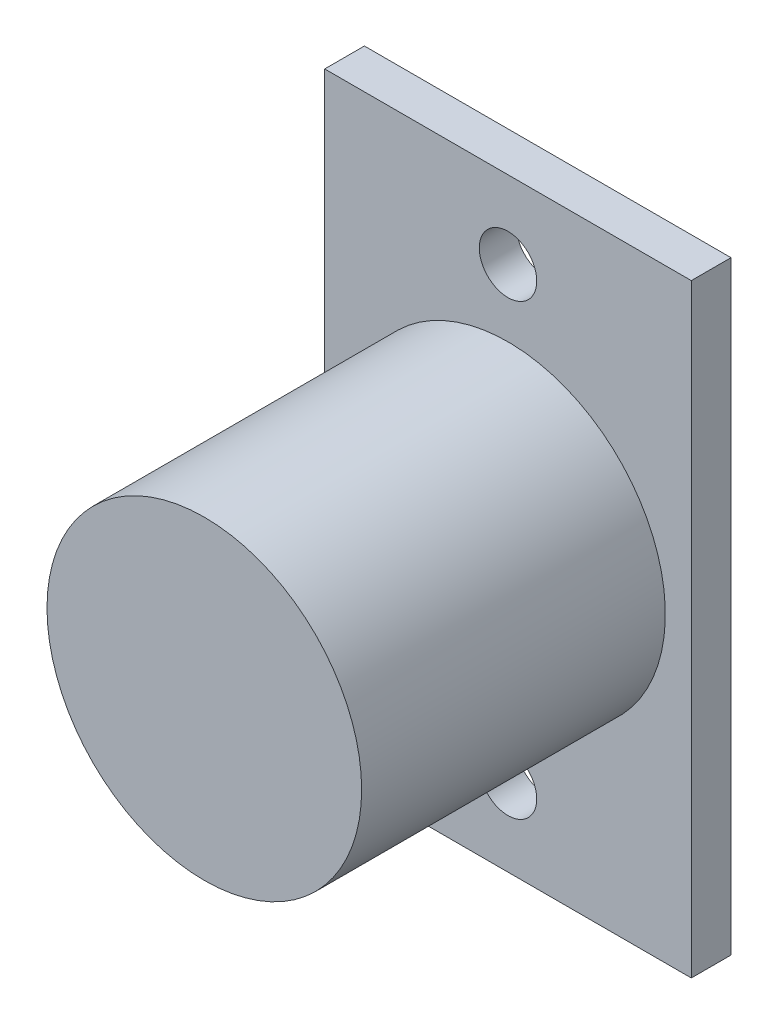
ISO-10303-21;
HEADER;
FILE_DESCRIPTION(('STEP AP214'),'2;1');
FILE_NAME('part.step','',(''),(''),'','','');
FILE_SCHEMA(('AUTOMOTIVE_DESIGN { 1 0 10303 214 1 1 1 1 }'));
ENDSEC;
DATA;
#1=APPLICATION_CONTEXT('core data for automotive mechanical design processes');
#2=APPLICATION_PROTOCOL_DEFINITION('international standard','automotive_design',2000,#1);
#3=PRODUCT_CONTEXT('',#1,'mechanical');
#4=PRODUCT('Part','Part','',(#3));
#5=PRODUCT_RELATED_PRODUCT_CATEGORY('part','',(#4));
#6=PRODUCT_DEFINITION_FORMATION('','',#4);
#7=PRODUCT_DEFINITION_CONTEXT('part definition',#1,'design');
#8=PRODUCT_DEFINITION('design','',#6,#7);
#9=PRODUCT_DEFINITION_SHAPE('','',#8);
#10=(LENGTH_UNIT() NAMED_UNIT(*) SI_UNIT(.MILLI.,.METRE.));
#11=(NAMED_UNIT(*) PLANE_ANGLE_UNIT() SI_UNIT($,.RADIAN.));
#12=(NAMED_UNIT(*) SI_UNIT($,.STERADIAN.) SOLID_ANGLE_UNIT());
#13=UNCERTAINTY_MEASURE_WITH_UNIT(LENGTH_MEASURE(1.E-05),#10,'distance_accuracy_value','');
#14=(GEOMETRIC_REPRESENTATION_CONTEXT(3) GLOBAL_UNCERTAINTY_ASSIGNED_CONTEXT((#13)) GLOBAL_UNIT_ASSIGNED_CONTEXT((#10,
#11,#12)) REPRESENTATION_CONTEXT('',''));
#15=CARTESIAN_POINT('',(0.,0.,0.));
#16=DIRECTION('',(0.,0.,1.));
#17=DIRECTION('',(1.,0.,0.));
#18=AXIS2_PLACEMENT_3D('',#15,#16,#17);
#19=CARTESIAN_POINT('',(0.,0.,2.3876));
#20=DIRECTION('',(0.,0.,-1.));
#21=DIRECTION('',(-1.,0.,0.));
#22=AXIS2_PLACEMENT_3D('',#19,#20,#21);
#23=PLANE('',#22);
#24=DIRECTION('',(0.,-1.,0.));
#25=VECTOR('',#24,1.);
#26=CARTESIAN_POINT('',(0.,0.,2.3876));
#27=LINE('',#26,#25);
#28=CARTESIAN_POINT('',(0.,36.322,2.3876));
#29=VERTEX_POINT('',#28);
#30=CARTESIAN_POINT('',(0.,0.,2.3876));
#31=VERTEX_POINT('',#30);
#32=EDGE_CURVE('E86',#29,#31,#27,.T.);
#33=ORIENTED_EDGE('',*,*,#32,.T.);
#34=DIRECTION('',(1.,0.,0.));
#35=VECTOR('',#34,1.);
#36=CARTESIAN_POINT('',(0.,0.,2.3876));
#37=LINE('',#36,#35);
#38=CARTESIAN_POINT('',(22.0472,0.,2.3876));
#39=VERTEX_POINT('',#38);
#40=EDGE_CURVE('E81',#31,#39,#37,.T.);
#41=ORIENTED_EDGE('',*,*,#40,.T.);
#42=DIRECTION('',(0.,1.,0.));
#43=VECTOR('',#42,1.);
#44=CARTESIAN_POINT('',(22.0472,0.,2.3876));
#45=LINE('',#44,#43);
#46=CARTESIAN_POINT('',(22.0472,36.322,2.3876));
#47=VERTEX_POINT('',#46);
#48=EDGE_CURVE('E84',#39,#47,#45,.T.);
#49=ORIENTED_EDGE('',*,*,#48,.T.);
#50=DIRECTION('',(-1.,0.,0.));
#51=VECTOR('',#50,1.);
#52=CARTESIAN_POINT('',(0.,36.322,2.3876));
#53=LINE('',#52,#51);
#54=EDGE_CURVE('E50',#47,#29,#53,.T.);
#55=ORIENTED_EDGE('',*,*,#54,.T.);
#56=EDGE_LOOP('',(#33,#41,#49,#55));
#57=FACE_BOUND('',#56,.T.);
#58=CARTESIAN_POINT('',(11.0236,31.6484,2.3876));
#59=DIRECTION('',(0.,0.,-1.));
#60=DIRECTION('',(-1.,0.,0.));
#61=AXIS2_PLACEMENT_3D('',#58,#59,#60);
#62=CIRCLE('',#61,1.7272);
#63=CARTESIAN_POINT('',(9.2964,31.6484,2.3876));
#64=VERTEX_POINT('',#63);
#65=EDGE_CURVE('E104',#64,#64,#62,.F.);
#66=ORIENTED_EDGE('',*,*,#65,.F.);
#67=EDGE_LOOP('',(#66));
#68=FACE_BOUND('',#67,.T.);
#69=CARTESIAN_POINT('',(11.0236,4.6736,2.3876));
#70=DIRECTION('',(0.,0.,-1.));
#71=DIRECTION('',(-1.,0.,0.));
#72=AXIS2_PLACEMENT_3D('',#69,#70,#71);
#73=CIRCLE('',#72,1.7272);
#74=CARTESIAN_POINT('',(9.2964,4.6736,2.3876));
#75=VERTEX_POINT('',#74);
#76=EDGE_CURVE('E139',#75,#75,#73,.F.);
#77=ORIENTED_EDGE('',*,*,#76,.F.);
#78=EDGE_LOOP('',(#77));
#79=FACE_BOUND('',#78,.T.);
#80=CARTESIAN_POINT('',(11.0236,18.161,2.3876));
#81=DIRECTION('',(0.,0.,-1.));
#82=DIRECTION('',(-1.,0.,0.));
#83=AXIS2_PLACEMENT_3D('',#80,#81,#82);
#84=CIRCLE('',#83,9.4615);
#85=CARTESIAN_POINT('',(1.5621,18.161,2.3876));
#86=VERTEX_POINT('',#85);
#87=EDGE_CURVE('E111',#86,#86,#84,.F.);
#88=ORIENTED_EDGE('',*,*,#87,.F.);
#89=EDGE_LOOP('',(#88));
#90=FACE_BOUND('',#89,.T.);
#91=ADVANCED_FACE('F33',(#57,#68,#79,#90),#23,.F.);
#92=CARTESIAN_POINT('',(0.,0.,2.3876));
#93=DIRECTION('',(1.,0.,0.));
#94=DIRECTION('',(0.,0.,-1.));
#95=AXIS2_PLACEMENT_3D('',#92,#93,#94);
#96=PLANE('',#95);
#97=DIRECTION('',(0.,-1.,0.));
#98=VECTOR('',#97,1.);
#99=CARTESIAN_POINT('',(0.,0.,0.));
#100=LINE('',#99,#98);
#101=CARTESIAN_POINT('',(0.,36.322,0.));
#102=VERTEX_POINT('',#101);
#103=CARTESIAN_POINT('',(0.,0.,0.));
#104=VERTEX_POINT('',#103);
#105=EDGE_CURVE('E101',#102,#104,#100,.T.);
#106=ORIENTED_EDGE('',*,*,#105,.T.);
#107=DIRECTION('',(0.,0.,-1.));
#108=VECTOR('',#107,1.);
#109=CARTESIAN_POINT('',(0.,0.,2.3876));
#110=LINE('',#109,#108);
#111=EDGE_CURVE('E92',#31,#104,#110,.T.);
#112=ORIENTED_EDGE('',*,*,#111,.F.);
#113=ORIENTED_EDGE('',*,*,#32,.F.);
#114=DIRECTION('',(0.,0.,-1.));
#115=VECTOR('',#114,1.);
#116=CARTESIAN_POINT('',(0.,36.322,2.3876));
#117=LINE('',#116,#115);
#118=EDGE_CURVE('E97',#29,#102,#117,.T.);
#119=ORIENTED_EDGE('',*,*,#118,.T.);
#120=EDGE_LOOP('',(#106,#112,#113,#119));
#121=FACE_BOUND('',#120,.T.);
#122=ADVANCED_FACE('F164',(#121),#96,.F.);
#123=CARTESIAN_POINT('',(0.,0.,2.3876));
#124=DIRECTION('',(0.,1.,0.));
#125=DIRECTION('',(0.,0.,1.));
#126=AXIS2_PLACEMENT_3D('',#123,#124,#125);
#127=PLANE('',#126);
#128=DIRECTION('',(1.,0.,0.));
#129=VECTOR('',#128,1.);
#130=CARTESIAN_POINT('',(0.,0.,0.));
#131=LINE('',#130,#129);
#132=CARTESIAN_POINT('',(22.0472,0.,0.));
#133=VERTEX_POINT('',#132);
#134=EDGE_CURVE('E91',#104,#133,#131,.T.);
#135=ORIENTED_EDGE('',*,*,#134,.T.);
#136=DIRECTION('',(0.,0.,-1.));
#137=VECTOR('',#136,1.);
#138=CARTESIAN_POINT('',(22.0472,0.,2.3876));
#139=LINE('',#138,#137);
#140=EDGE_CURVE('E89',#39,#133,#139,.T.);
#141=ORIENTED_EDGE('',*,*,#140,.F.);
#142=ORIENTED_EDGE('',*,*,#40,.F.);
#143=ORIENTED_EDGE('',*,*,#111,.T.);
#144=EDGE_LOOP('',(#135,#141,#142,#143));
#145=FACE_BOUND('',#144,.T.);
#146=ADVANCED_FACE('F90',(#145),#127,.F.);
#147=CARTESIAN_POINT('',(22.0472,0.,2.3876));
#148=DIRECTION('',(-1.,0.,0.));
#149=DIRECTION('',(0.,0.,1.));
#150=AXIS2_PLACEMENT_3D('',#147,#148,#149);
#151=PLANE('',#150);
#152=DIRECTION('',(0.,1.,0.));
#153=VECTOR('',#152,1.);
#154=CARTESIAN_POINT('',(22.0472,0.,0.));
#155=LINE('',#154,#153);
#156=CARTESIAN_POINT('',(22.0472,36.322,0.));
#157=VERTEX_POINT('',#156);
#158=EDGE_CURVE('E67',#133,#157,#155,.T.);
#159=ORIENTED_EDGE('',*,*,#158,.T.);
#160=DIRECTION('',(0.,0.,-1.));
#161=VECTOR('',#160,1.);
#162=CARTESIAN_POINT('',(22.0472,36.322,2.3876));
#163=LINE('',#162,#161);
#164=EDGE_CURVE('E93',#47,#157,#163,.T.);
#165=ORIENTED_EDGE('',*,*,#164,.F.);
#166=ORIENTED_EDGE('',*,*,#48,.F.);
#167=ORIENTED_EDGE('',*,*,#140,.T.);
#168=EDGE_LOOP('',(#159,#165,#166,#167));
#169=FACE_BOUND('',#168,.T.);
#170=ADVANCED_FACE('F95',(#169),#151,.F.);
#171=CARTESIAN_POINT('',(0.,36.322,2.3876));
#172=DIRECTION('',(0.,-1.,0.));
#173=DIRECTION('',(0.,0.,-1.));
#174=AXIS2_PLACEMENT_3D('',#171,#172,#173);
#175=PLANE('',#174);
#176=DIRECTION('',(-1.,0.,0.));
#177=VECTOR('',#176,1.);
#178=CARTESIAN_POINT('',(0.,36.322,0.));
#179=LINE('',#178,#177);
#180=EDGE_CURVE('E73',#157,#102,#179,.T.);
#181=ORIENTED_EDGE('',*,*,#180,.T.);
#182=ORIENTED_EDGE('',*,*,#118,.F.);
#183=ORIENTED_EDGE('',*,*,#54,.F.);
#184=ORIENTED_EDGE('',*,*,#164,.T.);
#185=EDGE_LOOP('',(#181,#182,#183,#184));
#186=FACE_BOUND('',#185,.T.);
#187=ADVANCED_FACE('F175',(#186),#175,.F.);
#188=CARTESIAN_POINT('',(0.,0.,0.));
#189=DIRECTION('',(0.,0.,-1.));
#190=DIRECTION('',(-1.,0.,0.));
#191=AXIS2_PLACEMENT_3D('',#188,#189,#190);
#192=PLANE('',#191);
#193=CARTESIAN_POINT('',(11.0236,4.6736,0.));
#194=DIRECTION('',(0.,0.,-1.));
#195=DIRECTION('',(-1.,0.,0.));
#196=AXIS2_PLACEMENT_3D('',#193,#194,#195);
#197=CIRCLE('',#196,2.85750000000002);
#198=CARTESIAN_POINT('',(8.16609999999998,4.6736,0.));
#199=VERTEX_POINT('',#198);
#200=EDGE_CURVE('E42',#199,#199,#197,.F.);
#201=ORIENTED_EDGE('',*,*,#200,.T.);
#202=EDGE_LOOP('',(#201));
#203=FACE_BOUND('',#202,.T.);
#204=CARTESIAN_POINT('',(11.0236,31.6484,0.));
#205=DIRECTION('',(0.,0.,-1.));
#206=DIRECTION('',(-1.,0.,0.));
#207=AXIS2_PLACEMENT_3D('',#204,#205,#206);
#208=CIRCLE('',#207,2.85750000000002);
#209=CARTESIAN_POINT('',(8.16609999999998,31.6484,0.));
#210=VERTEX_POINT('',#209);
#211=EDGE_CURVE('E117',#210,#210,#208,.F.);
#212=ORIENTED_EDGE('',*,*,#211,.T.);
#213=EDGE_LOOP('',(#212));
#214=FACE_BOUND('',#213,.T.);
#215=CARTESIAN_POINT('',(11.0236,18.161,0.));
#216=DIRECTION('',(0.,0.,-1.));
#217=DIRECTION('',(-1.,0.,0.));
#218=AXIS2_PLACEMENT_3D('',#215,#216,#217);
#219=CIRCLE('',#218,8.89);
#220=CARTESIAN_POINT('',(2.1336,18.161,0.));
#221=VERTEX_POINT('',#220);
#222=EDGE_CURVE('E141',#221,#221,#219,.T.);
#223=ORIENTED_EDGE('',*,*,#222,.F.);
#224=EDGE_LOOP('',(#223));
#225=FACE_BOUND('',#224,.T.);
#226=ORIENTED_EDGE('',*,*,#105,.F.);
#227=ORIENTED_EDGE('',*,*,#180,.F.);
#228=ORIENTED_EDGE('',*,*,#158,.F.);
#229=ORIENTED_EDGE('',*,*,#134,.F.);
#230=EDGE_LOOP('',(#226,#227,#228,#229));
#231=FACE_BOUND('',#230,.T.);
#232=ADVANCED_FACE('F122',(#203,#214,#225,#231),#192,.T.);
#233=CARTESIAN_POINT('',(11.0236,31.6484,2.3886));
#234=DIRECTION('',(0.,0.,-1.));
#235=DIRECTION('',(-1.,0.,0.));
#236=AXIS2_PLACEMENT_3D('',#233,#234,#235);
#237=CYLINDRICAL_SURFACE('',#236,1.7272);
#238=CARTESIAN_POINT('',(11.0236,31.6484,0.158853305464113));
#239=DIRECTION('',(0.,0.,-1.));
#240=DIRECTION('',(-1.,0.,0.));
#241=AXIS2_PLACEMENT_3D('',#238,#239,#240);
#242=CIRCLE('',#241,1.7272);
#243=CARTESIAN_POINT('',(9.2964,31.6484,0.158853305464113));
#244=VERTEX_POINT('',#243);
#245=EDGE_CURVE('E11',#244,#244,#242,.T.);
#246=ORIENTED_EDGE('',*,*,#245,.T.);
#247=EDGE_LOOP('',(#246));
#248=FACE_BOUND('',#247,.T.);
#249=ORIENTED_EDGE('',*,*,#65,.T.);
#250=EDGE_LOOP('',(#249));
#251=FACE_BOUND('',#250,.T.);
#252=ADVANCED_FACE('F135',(#248,#251),#237,.F.);
#253=CARTESIAN_POINT('',(11.0236,4.6736,2.3886));
#254=DIRECTION('',(0.,0.,-1.));
#255=DIRECTION('',(-1.,0.,0.));
#256=AXIS2_PLACEMENT_3D('',#253,#254,#255);
#257=CYLINDRICAL_SURFACE('',#256,1.7272);
#258=CARTESIAN_POINT('',(11.0236,4.6736,0.158853305464115));
#259=DIRECTION('',(0.,0.,-1.));
#260=DIRECTION('',(-1.,0.,0.));
#261=AXIS2_PLACEMENT_3D('',#258,#259,#260);
#262=CIRCLE('',#261,1.7272);
#263=CARTESIAN_POINT('',(9.2964,4.6736,0.158853305464115));
#264=VERTEX_POINT('',#263);
#265=EDGE_CURVE('E114',#264,#264,#262,.T.);
#266=ORIENTED_EDGE('',*,*,#265,.T.);
#267=EDGE_LOOP('',(#266));
#268=FACE_BOUND('',#267,.T.);
#269=ORIENTED_EDGE('',*,*,#76,.T.);
#270=EDGE_LOOP('',(#269));
#271=FACE_BOUND('',#270,.T.);
#272=ADVANCED_FACE('F131',(#268,#271),#257,.F.);
#273=CARTESIAN_POINT('',(11.0236,18.161,2.3886));
#274=DIRECTION('',(0.,0.,-1.));
#275=DIRECTION('',(-1.,0.,0.));
#276=AXIS2_PLACEMENT_3D('',#273,#274,#275);
#277=CYLINDRICAL_SURFACE('',#276,8.89);
#278=ORIENTED_EDGE('',*,*,#222,.T.);
#279=EDGE_LOOP('',(#278));
#280=FACE_BOUND('',#279,.T.);
#281=CARTESIAN_POINT('',(11.0236,18.161,2.3876));
#282=DIRECTION('',(0.,0.,1.));
#283=DIRECTION('',(1.,0.,0.));
#284=AXIS2_PLACEMENT_3D('',#281,#282,#283);
#285=CIRCLE('',#284,8.89);
#286=CARTESIAN_POINT('',(19.9136,18.161,2.3876));
#287=VERTEX_POINT('',#286);
#288=EDGE_CURVE('E146',#287,#287,#285,.F.);
#289=ORIENTED_EDGE('',*,*,#288,.F.);
#290=EDGE_LOOP('',(#289));
#291=FACE_BOUND('',#290,.T.);
#292=ADVANCED_FACE('F134',(#280,#291),#277,.F.);
#293=CARTESIAN_POINT('',(11.0236,18.161,2.3876));
#294=DIRECTION('',(0.,0.,1.));
#295=DIRECTION('',(1.,0.,0.));
#296=AXIS2_PLACEMENT_3D('',#293,#294,#295);
#297=PLANE('',#296);
#298=ORIENTED_EDGE('',*,*,#288,.T.);
#299=EDGE_LOOP('',(#298));
#300=FACE_BOUND('',#299,.T.);
#301=ADVANCED_FACE('F159',(#300),#297,.F.);
#302=CARTESIAN_POINT('',(11.0236,18.161,20.6502));
#303=DIRECTION('',(0.,0.,-1.));
#304=DIRECTION('',(-1.,0.,0.));
#305=AXIS2_PLACEMENT_3D('',#302,#303,#304);
#306=CYLINDRICAL_SURFACE('',#305,9.4615);
#307=CARTESIAN_POINT('',(11.0236,18.161,20.6502));
#308=DIRECTION('',(0.,0.,1.));
#309=DIRECTION('',(1.,0.,0.));
#310=AXIS2_PLACEMENT_3D('',#307,#308,#309);
#311=CIRCLE('',#310,9.4615);
#312=CARTESIAN_POINT('',(20.4851,18.161,20.6502));
#313=VERTEX_POINT('',#312);
#314=EDGE_CURVE('E151',#313,#313,#311,.T.);
#315=ORIENTED_EDGE('',*,*,#314,.F.);
#316=EDGE_LOOP('',(#315));
#317=FACE_BOUND('',#316,.T.);
#318=ORIENTED_EDGE('',*,*,#87,.T.);
#319=EDGE_LOOP('',(#318));
#320=FACE_BOUND('',#319,.T.);
#321=ADVANCED_FACE('F156',(#317,#320),#306,.T.);
#322=CARTESIAN_POINT('',(11.0236,18.161,20.6502));
#323=DIRECTION('',(0.,0.,1.));
#324=DIRECTION('',(1.,0.,0.));
#325=AXIS2_PLACEMENT_3D('',#322,#323,#324);
#326=PLANE('',#325);
#327=ORIENTED_EDGE('',*,*,#314,.T.);
#328=EDGE_LOOP('',(#327));
#329=FACE_BOUND('',#328,.T.);
#330=ADVANCED_FACE('F128',(#329),#326,.T.);
#331=CARTESIAN_POINT('',(11.0236,4.6736,0.158853305464115));
#332=DIRECTION('',(0.,0.,-1.));
#333=DIRECTION('',(-1.,0.,0.));
#334=AXIS2_PLACEMENT_3D('',#331,#332,#333);
#335=CONICAL_SURFACE('',#334,1.7272,1.43116998663535);
#336=ORIENTED_EDGE('',*,*,#200,.F.);
#337=EDGE_LOOP('',(#336));
#338=FACE_BOUND('',#337,.T.);
#339=ORIENTED_EDGE('',*,*,#265,.F.);
#340=EDGE_LOOP('',(#339));
#341=FACE_BOUND('',#340,.T.);
#342=ADVANCED_FACE('F125',(#338,#341),#335,.F.);
#343=CARTESIAN_POINT('',(11.0236,31.6484,0.158853305464113));
#344=DIRECTION('',(0.,0.,-1.));
#345=DIRECTION('',(-1.,0.,0.));
#346=AXIS2_PLACEMENT_3D('',#343,#344,#345);
#347=CONICAL_SURFACE('',#346,1.7272,1.43116998663535);
#348=ORIENTED_EDGE('',*,*,#211,.F.);
#349=EDGE_LOOP('',(#348));
#350=FACE_BOUND('',#349,.T.);
#351=ORIENTED_EDGE('',*,*,#245,.F.);
#352=EDGE_LOOP('',(#351));
#353=FACE_BOUND('',#352,.T.);
#354=ADVANCED_FACE('F35',(#350,#353),#347,.F.);
#355=CLOSED_SHELL('',(#91,#122,#146,#170,#187,#232,#252,#272,#292,#301,#321,#330,#342,#354));
#356=MANIFOLD_SOLID_BREP('B2',#355);
#357=ADVANCED_BREP_SHAPE_REPRESENTATION('',(#18,#356),#14);
#358=SHAPE_DEFINITION_REPRESENTATION(#9,#357);
ENDSEC;
END-ISO-10303-21;
